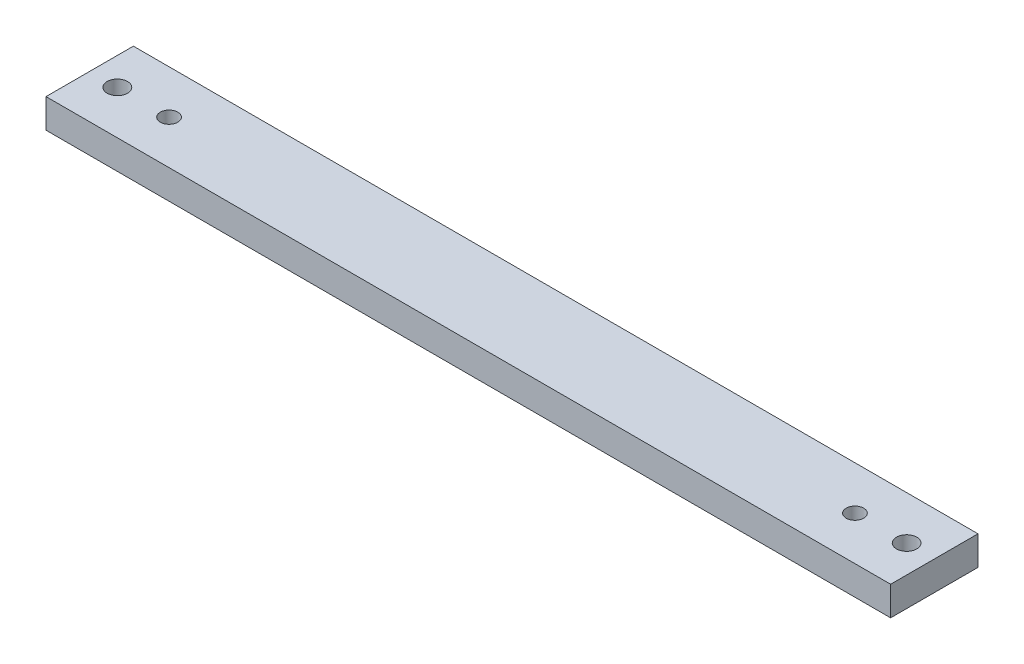
ISO-10303-21;
HEADER;
FILE_DESCRIPTION(('STEP AP214'),'2;1');
FILE_NAME('part.step','',(''),(''),'','','');
FILE_SCHEMA(('AUTOMOTIVE_DESIGN { 1 0 10303 214 1 1 1 1 }'));
ENDSEC;
DATA;
#1=APPLICATION_CONTEXT('core data for automotive mechanical design processes');
#2=APPLICATION_PROTOCOL_DEFINITION('international standard','automotive_design',2000,#1);
#3=PRODUCT_CONTEXT('',#1,'mechanical');
#4=PRODUCT('Part','Part','',(#3));
#5=PRODUCT_RELATED_PRODUCT_CATEGORY('part','',(#4));
#6=PRODUCT_DEFINITION_FORMATION('','',#4);
#7=PRODUCT_DEFINITION_CONTEXT('part definition',#1,'design');
#8=PRODUCT_DEFINITION('design','',#6,#7);
#9=PRODUCT_DEFINITION_SHAPE('','',#8);
#10=(LENGTH_UNIT() NAMED_UNIT(*) SI_UNIT(.MILLI.,.METRE.));
#11=(NAMED_UNIT(*) PLANE_ANGLE_UNIT() SI_UNIT($,.RADIAN.));
#12=(NAMED_UNIT(*) SI_UNIT($,.STERADIAN.) SOLID_ANGLE_UNIT());
#13=UNCERTAINTY_MEASURE_WITH_UNIT(LENGTH_MEASURE(1.E-05),#10,'distance_accuracy_value','');
#14=(GEOMETRIC_REPRESENTATION_CONTEXT(3) GLOBAL_UNCERTAINTY_ASSIGNED_CONTEXT((#13)) GLOBAL_UNIT_ASSIGNED_CONTEXT((#10,
#11,#12)) REPRESENTATION_CONTEXT('',''));
#15=CARTESIAN_POINT('',(0.,0.,0.));
#16=DIRECTION('',(0.,0.,1.));
#17=DIRECTION('',(1.,0.,0.));
#18=AXIS2_PLACEMENT_3D('',#15,#16,#17);
#19=CARTESIAN_POINT('',(0.,20.,-80.));
#20=DIRECTION('',(1.,0.,0.));
#21=DIRECTION('',(0.,0.,-1.));
#22=AXIS2_PLACEMENT_3D('',#19,#20,#21);
#23=PLANE('',#22);
#24=DIRECTION('',(0.,0.,1.));
#25=VECTOR('',#24,1.);
#26=CARTESIAN_POINT('',(0.,0.,-80.));
#27=LINE('',#26,#25);
#28=CARTESIAN_POINT('',(0.,0.,-80.));
#29=VERTEX_POINT('',#28);
#30=CARTESIAN_POINT('',(0.,0.,-20.));
#31=VERTEX_POINT('',#30);
#32=EDGE_CURVE('E99',#29,#31,#27,.T.);
#33=ORIENTED_EDGE('',*,*,#32,.T.);
#34=DIRECTION('',(0.,-1.,0.));
#35=VECTOR('',#34,1.);
#36=CARTESIAN_POINT('',(0.,20.,-20.));
#37=LINE('',#36,#35);
#38=CARTESIAN_POINT('',(0.,20.,-20.));
#39=VERTEX_POINT('',#38);
#40=EDGE_CURVE('E11',#39,#31,#37,.T.);
#41=ORIENTED_EDGE('',*,*,#40,.F.);
#42=DIRECTION('',(0.,0.,1.));
#43=VECTOR('',#42,1.);
#44=CARTESIAN_POINT('',(0.,20.,-80.));
#45=LINE('',#44,#43);
#46=CARTESIAN_POINT('',(0.,20.,-80.));
#47=VERTEX_POINT('',#46);
#48=EDGE_CURVE('E87',#47,#39,#45,.T.);
#49=ORIENTED_EDGE('',*,*,#48,.F.);
#50=DIRECTION('',(0.,-1.,0.));
#51=VECTOR('',#50,1.);
#52=CARTESIAN_POINT('',(0.,20.,-80.));
#53=LINE('',#52,#51);
#54=EDGE_CURVE('E95',#47,#29,#53,.T.);
#55=ORIENTED_EDGE('',*,*,#54,.T.);
#56=EDGE_LOOP('',(#33,#41,#49,#55));
#57=FACE_BOUND('',#56,.T.);
#58=ADVANCED_FACE('F36',(#57),#23,.F.);
#59=CARTESIAN_POINT('',(0.,20.,-20.));
#60=DIRECTION('',(0.,0.,-1.));
#61=DIRECTION('',(-1.,0.,0.));
#62=AXIS2_PLACEMENT_3D('',#59,#60,#61);
#63=PLANE('',#62);
#64=DIRECTION('',(1.,0.,0.));
#65=VECTOR('',#64,1.);
#66=CARTESIAN_POINT('',(0.,0.,-20.));
#67=LINE('',#66,#65);
#68=CARTESIAN_POINT('',(580.,0.,-20.));
#69=VERTEX_POINT('',#68);
#70=EDGE_CURVE('E91',#31,#69,#67,.T.);
#71=ORIENTED_EDGE('',*,*,#70,.T.);
#72=DIRECTION('',(0.,-1.,0.));
#73=VECTOR('',#72,1.);
#74=CARTESIAN_POINT('',(580.,20.,-20.));
#75=LINE('',#74,#73);
#76=CARTESIAN_POINT('',(580.,20.,-20.));
#77=VERTEX_POINT('',#76);
#78=EDGE_CURVE('E44',#77,#69,#75,.T.);
#79=ORIENTED_EDGE('',*,*,#78,.F.);
#80=DIRECTION('',(1.,0.,0.));
#81=VECTOR('',#80,1.);
#82=CARTESIAN_POINT('',(0.,20.,-20.));
#83=LINE('',#82,#81);
#84=EDGE_CURVE('E82',#39,#77,#83,.T.);
#85=ORIENTED_EDGE('',*,*,#84,.F.);
#86=ORIENTED_EDGE('',*,*,#40,.T.);
#87=EDGE_LOOP('',(#71,#79,#85,#86));
#88=FACE_BOUND('',#87,.T.);
#89=ADVANCED_FACE('F90',(#88),#63,.F.);
#90=CARTESIAN_POINT('',(580.,20.,-80.));
#91=DIRECTION('',(-1.,0.,0.));
#92=DIRECTION('',(0.,0.,1.));
#93=AXIS2_PLACEMENT_3D('',#90,#91,#92);
#94=PLANE('',#93);
#95=DIRECTION('',(0.,0.,-1.));
#96=VECTOR('',#95,1.);
#97=CARTESIAN_POINT('',(580.,0.,-80.));
#98=LINE('',#97,#96);
#99=CARTESIAN_POINT('',(580.,0.,-80.));
#100=VERTEX_POINT('',#99);
#101=EDGE_CURVE('E69',#69,#100,#98,.T.);
#102=ORIENTED_EDGE('',*,*,#101,.T.);
#103=DIRECTION('',(0.,-1.,0.));
#104=VECTOR('',#103,1.);
#105=CARTESIAN_POINT('',(580.,20.,-80.));
#106=LINE('',#105,#104);
#107=CARTESIAN_POINT('',(580.,20.,-80.));
#108=VERTEX_POINT('',#107);
#109=EDGE_CURVE('E92',#108,#100,#106,.T.);
#110=ORIENTED_EDGE('',*,*,#109,.F.);
#111=DIRECTION('',(0.,0.,-1.));
#112=VECTOR('',#111,1.);
#113=CARTESIAN_POINT('',(580.,20.,-80.));
#114=LINE('',#113,#112);
#115=EDGE_CURVE('E85',#77,#108,#114,.T.);
#116=ORIENTED_EDGE('',*,*,#115,.F.);
#117=ORIENTED_EDGE('',*,*,#78,.T.);
#118=EDGE_LOOP('',(#102,#110,#116,#117));
#119=FACE_BOUND('',#118,.T.);
#120=ADVANCED_FACE('F93',(#119),#94,.F.);
#121=CARTESIAN_POINT('',(0.,20.,-80.));
#122=DIRECTION('',(0.,0.,1.));
#123=DIRECTION('',(1.,0.,0.));
#124=AXIS2_PLACEMENT_3D('',#121,#122,#123);
#125=PLANE('',#124);
#126=DIRECTION('',(-1.,0.,0.));
#127=VECTOR('',#126,1.);
#128=CARTESIAN_POINT('',(0.,0.,-80.));
#129=LINE('',#128,#127);
#130=EDGE_CURVE('E75',#100,#29,#129,.T.);
#131=ORIENTED_EDGE('',*,*,#130,.T.);
#132=ORIENTED_EDGE('',*,*,#54,.F.);
#133=DIRECTION('',(-1.,0.,0.));
#134=VECTOR('',#133,1.);
#135=CARTESIAN_POINT('',(0.,20.,-80.));
#136=LINE('',#135,#134);
#137=EDGE_CURVE('E52',#108,#47,#136,.T.);
#138=ORIENTED_EDGE('',*,*,#137,.F.);
#139=ORIENTED_EDGE('',*,*,#109,.T.);
#140=EDGE_LOOP('',(#131,#132,#138,#139));
#141=FACE_BOUND('',#140,.T.);
#142=ADVANCED_FACE('F107',(#141),#125,.F.);
#143=CARTESIAN_POINT('',(0.,20.,0.));
#144=DIRECTION('',(0.,1.,0.));
#145=DIRECTION('',(0.,0.,1.));
#146=AXIS2_PLACEMENT_3D('',#143,#144,#145);
#147=PLANE('',#146);
#148=CARTESIAN_POINT('',(19.,20.,-50.));
#149=DIRECTION('',(0.,1.,0.));
#150=DIRECTION('',(0.,0.,1.));
#151=AXIS2_PLACEMENT_3D('',#148,#149,#150);
#152=CIRCLE('',#151,7.);
#153=CARTESIAN_POINT('',(19.,20.,-43.));
#154=VERTEX_POINT('',#153);
#155=EDGE_CURVE('E131',#154,#154,#152,.T.);
#156=ORIENTED_EDGE('',*,*,#155,.F.);
#157=EDGE_LOOP('',(#156));
#158=FACE_BOUND('',#157,.T.);
#159=CARTESIAN_POINT('',(54.5,20.,-50.));
#160=DIRECTION('',(0.,1.,0.));
#161=DIRECTION('',(0.,0.,1.));
#162=AXIS2_PLACEMENT_3D('',#159,#160,#161);
#163=CIRCLE('',#162,6.00000000000001);
#164=CARTESIAN_POINT('',(54.5,20.,-44.));
#165=VERTEX_POINT('',#164);
#166=EDGE_CURVE('E125',#165,#165,#163,.T.);
#167=ORIENTED_EDGE('',*,*,#166,.F.);
#168=EDGE_LOOP('',(#167));
#169=FACE_BOUND('',#168,.T.);
#170=CARTESIAN_POINT('',(525.5,20.,-50.));
#171=DIRECTION('',(0.,1.,0.));
#172=DIRECTION('',(0.,0.,1.));
#173=AXIS2_PLACEMENT_3D('',#170,#171,#172);
#174=CIRCLE('',#173,5.99999999999999);
#175=CARTESIAN_POINT('',(525.5,20.,-44.));
#176=VERTEX_POINT('',#175);
#177=EDGE_CURVE('E119',#176,#176,#174,.T.);
#178=ORIENTED_EDGE('',*,*,#177,.F.);
#179=EDGE_LOOP('',(#178));
#180=FACE_BOUND('',#179,.T.);
#181=CARTESIAN_POINT('',(561.,20.,-50.));
#182=DIRECTION('',(0.,1.,0.));
#183=DIRECTION('',(0.,0.,1.));
#184=AXIS2_PLACEMENT_3D('',#181,#182,#183);
#185=CIRCLE('',#184,7.00000000000004);
#186=CARTESIAN_POINT('',(561.,20.,-43.));
#187=VERTEX_POINT('',#186);
#188=EDGE_CURVE('E113',#187,#187,#185,.T.);
#189=ORIENTED_EDGE('',*,*,#188,.F.);
#190=EDGE_LOOP('',(#189));
#191=FACE_BOUND('',#190,.T.);
#192=ORIENTED_EDGE('',*,*,#48,.T.);
#193=ORIENTED_EDGE('',*,*,#84,.T.);
#194=ORIENTED_EDGE('',*,*,#115,.T.);
#195=ORIENTED_EDGE('',*,*,#137,.T.);
#196=EDGE_LOOP('',(#192,#193,#194,#195));
#197=FACE_BOUND('',#196,.T.);
#198=ADVANCED_FACE('F83',(#158,#169,#180,#191,#197),#147,.T.);
#199=CARTESIAN_POINT('',(0.,0.,0.));
#200=DIRECTION('',(0.,1.,0.));
#201=DIRECTION('',(0.,0.,1.));
#202=AXIS2_PLACEMENT_3D('',#199,#200,#201);
#203=PLANE('',#202);
#204=CARTESIAN_POINT('',(19.,0.,-50.));
#205=DIRECTION('',(0.,1.,0.));
#206=DIRECTION('',(0.,0.,1.));
#207=AXIS2_PLACEMENT_3D('',#204,#205,#206);
#208=CIRCLE('',#207,7.);
#209=CARTESIAN_POINT('',(19.,0.,-43.));
#210=VERTEX_POINT('',#209);
#211=EDGE_CURVE('E102',#210,#210,#208,.T.);
#212=ORIENTED_EDGE('',*,*,#211,.T.);
#213=EDGE_LOOP('',(#212));
#214=FACE_BOUND('',#213,.T.);
#215=CARTESIAN_POINT('',(54.5,0.,-50.));
#216=DIRECTION('',(0.,1.,0.));
#217=DIRECTION('',(0.,0.,1.));
#218=AXIS2_PLACEMENT_3D('',#215,#216,#217);
#219=CIRCLE('',#218,6.00000000000001);
#220=CARTESIAN_POINT('',(54.5,0.,-44.));
#221=VERTEX_POINT('',#220);
#222=EDGE_CURVE('E128',#221,#221,#219,.T.);
#223=ORIENTED_EDGE('',*,*,#222,.T.);
#224=EDGE_LOOP('',(#223));
#225=FACE_BOUND('',#224,.T.);
#226=CARTESIAN_POINT('',(525.5,0.,-50.));
#227=DIRECTION('',(0.,1.,0.));
#228=DIRECTION('',(0.,0.,1.));
#229=AXIS2_PLACEMENT_3D('',#226,#227,#228);
#230=CIRCLE('',#229,5.99999999999999);
#231=CARTESIAN_POINT('',(525.5,0.,-44.));
#232=VERTEX_POINT('',#231);
#233=EDGE_CURVE('E122',#232,#232,#230,.T.);
#234=ORIENTED_EDGE('',*,*,#233,.T.);
#235=EDGE_LOOP('',(#234));
#236=FACE_BOUND('',#235,.T.);
#237=CARTESIAN_POINT('',(561.,0.,-50.));
#238=DIRECTION('',(0.,1.,0.));
#239=DIRECTION('',(0.,0.,1.));
#240=AXIS2_PLACEMENT_3D('',#237,#238,#239);
#241=CIRCLE('',#240,7.00000000000004);
#242=CARTESIAN_POINT('',(561.,0.,-43.));
#243=VERTEX_POINT('',#242);
#244=EDGE_CURVE('E116',#243,#243,#241,.T.);
#245=ORIENTED_EDGE('',*,*,#244,.T.);
#246=EDGE_LOOP('',(#245));
#247=FACE_BOUND('',#246,.T.);
#248=ORIENTED_EDGE('',*,*,#32,.F.);
#249=ORIENTED_EDGE('',*,*,#130,.F.);
#250=ORIENTED_EDGE('',*,*,#101,.F.);
#251=ORIENTED_EDGE('',*,*,#70,.F.);
#252=EDGE_LOOP('',(#248,#249,#250,#251));
#253=FACE_BOUND('',#252,.T.);
#254=ADVANCED_FACE('F110',(#214,#225,#236,#247,#253),#203,.F.);
#255=CARTESIAN_POINT('',(561.,0.,-50.));
#256=DIRECTION('',(0.,1.,0.));
#257=DIRECTION('',(0.,0.,1.));
#258=AXIS2_PLACEMENT_3D('',#255,#256,#257);
#259=CYLINDRICAL_SURFACE('',#258,7.00000000000004);
#260=ORIENTED_EDGE('',*,*,#244,.F.);
#261=EDGE_LOOP('',(#260));
#262=FACE_BOUND('',#261,.T.);
#263=ORIENTED_EDGE('',*,*,#188,.T.);
#264=EDGE_LOOP('',(#263));
#265=FACE_BOUND('',#264,.T.);
#266=ADVANCED_FACE('F155',(#262,#265),#259,.F.);
#267=CARTESIAN_POINT('',(525.5,0.,-50.));
#268=DIRECTION('',(0.,1.,0.));
#269=DIRECTION('',(0.,0.,1.));
#270=AXIS2_PLACEMENT_3D('',#267,#268,#269);
#271=CYLINDRICAL_SURFACE('',#270,5.99999999999999);
#272=ORIENTED_EDGE('',*,*,#233,.F.);
#273=EDGE_LOOP('',(#272));
#274=FACE_BOUND('',#273,.T.);
#275=ORIENTED_EDGE('',*,*,#177,.T.);
#276=EDGE_LOOP('',(#275));
#277=FACE_BOUND('',#276,.T.);
#278=ADVANCED_FACE('F157',(#274,#277),#271,.F.);
#279=CARTESIAN_POINT('',(54.5,0.,-50.));
#280=DIRECTION('',(0.,1.,0.));
#281=DIRECTION('',(0.,0.,1.));
#282=AXIS2_PLACEMENT_3D('',#279,#280,#281);
#283=CYLINDRICAL_SURFACE('',#282,6.00000000000001);
#284=ORIENTED_EDGE('',*,*,#222,.F.);
#285=EDGE_LOOP('',(#284));
#286=FACE_BOUND('',#285,.T.);
#287=ORIENTED_EDGE('',*,*,#166,.T.);
#288=EDGE_LOOP('',(#287));
#289=FACE_BOUND('',#288,.T.);
#290=ADVANCED_FACE('F142',(#286,#289),#283,.F.);
#291=CARTESIAN_POINT('',(19.,0.,-50.));
#292=DIRECTION('',(0.,1.,0.));
#293=DIRECTION('',(0.,0.,1.));
#294=AXIS2_PLACEMENT_3D('',#291,#292,#293);
#295=CYLINDRICAL_SURFACE('',#294,7.);
#296=ORIENTED_EDGE('',*,*,#211,.F.);
#297=EDGE_LOOP('',(#296));
#298=FACE_BOUND('',#297,.T.);
#299=ORIENTED_EDGE('',*,*,#155,.T.);
#300=EDGE_LOOP('',(#299));
#301=FACE_BOUND('',#300,.T.);
#302=ADVANCED_FACE('F139',(#298,#301),#295,.F.);
#303=CLOSED_SHELL('',(#58,#89,#120,#142,#198,#254,#266,#278,#290,#302));
#304=MANIFOLD_SOLID_BREP('B2',#303);
#305=ADVANCED_BREP_SHAPE_REPRESENTATION('',(#18,#304),#14);
#306=SHAPE_DEFINITION_REPRESENTATION(#9,#305);
ENDSEC;
END-ISO-10303-21;
